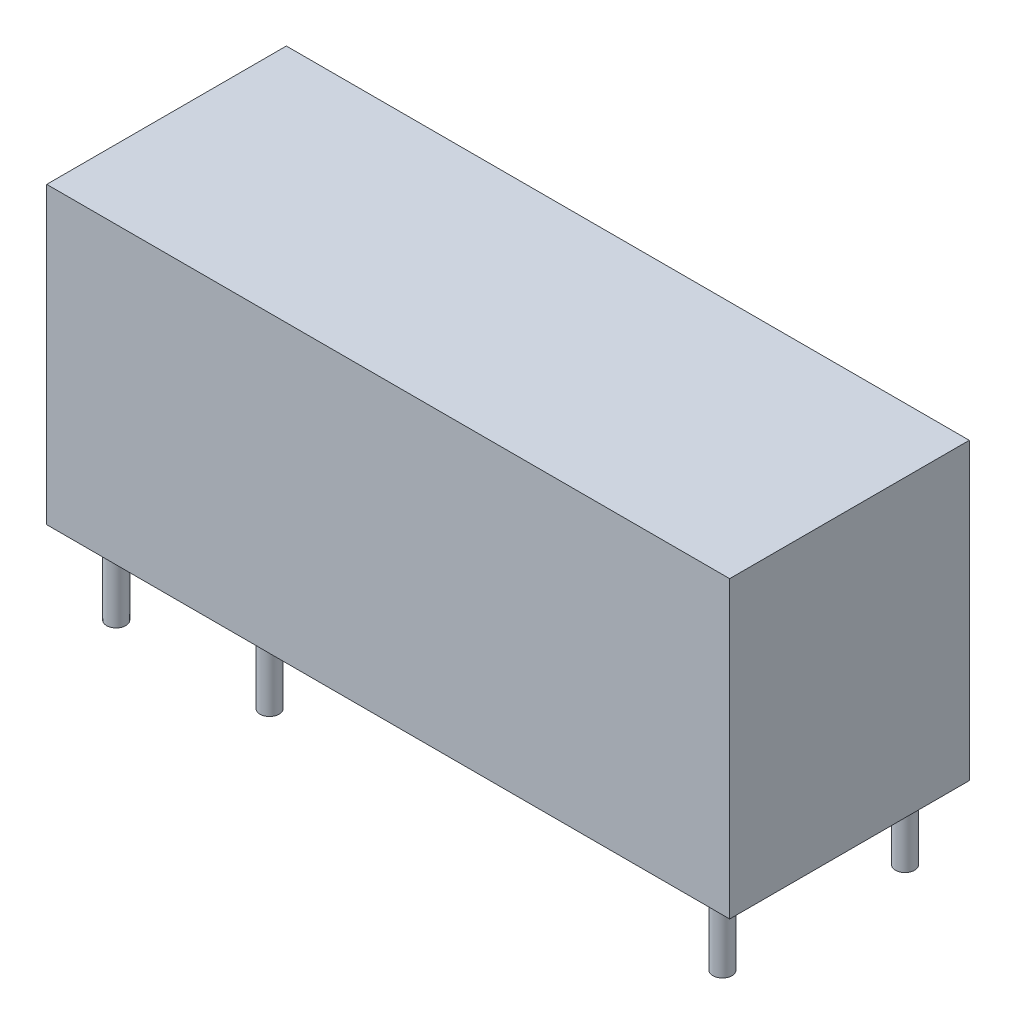
ISO-10303-21;
HEADER;
FILE_DESCRIPTION(('STEP AP214'),'2;1');
FILE_NAME('part.step','',(''),(''),'','','');
FILE_SCHEMA(('AUTOMOTIVE_DESIGN { 1 0 10303 214 1 1 1 1 }'));
ENDSEC;
DATA;
#1=APPLICATION_CONTEXT('core data for automotive mechanical design processes');
#2=APPLICATION_PROTOCOL_DEFINITION('international standard','automotive_design',2000,#1);
#3=PRODUCT_CONTEXT('',#1,'mechanical');
#4=PRODUCT('Part','Part','',(#3));
#5=PRODUCT_RELATED_PRODUCT_CATEGORY('part','',(#4));
#6=PRODUCT_DEFINITION_FORMATION('','',#4);
#7=PRODUCT_DEFINITION_CONTEXT('part definition',#1,'design');
#8=PRODUCT_DEFINITION('design','',#6,#7);
#9=PRODUCT_DEFINITION_SHAPE('','',#8);
#10=(LENGTH_UNIT() NAMED_UNIT(*) SI_UNIT(.MILLI.,.METRE.));
#11=(NAMED_UNIT(*) PLANE_ANGLE_UNIT() SI_UNIT($,.RADIAN.));
#12=(NAMED_UNIT(*) SI_UNIT($,.STERADIAN.) SOLID_ANGLE_UNIT());
#13=UNCERTAINTY_MEASURE_WITH_UNIT(LENGTH_MEASURE(1.E-05),#10,'distance_accuracy_value','');
#14=(GEOMETRIC_REPRESENTATION_CONTEXT(3) GLOBAL_UNCERTAINTY_ASSIGNED_CONTEXT((#13)) GLOBAL_UNIT_ASSIGNED_CONTEXT((#10,
#11,#12)) REPRESENTATION_CONTEXT('',''));
#15=CARTESIAN_POINT('',(0.,0.,0.));
#16=DIRECTION('',(0.,0.,1.));
#17=DIRECTION('',(1.,0.,0.));
#18=AXIS2_PLACEMENT_3D('',#15,#16,#17);
#19=CARTESIAN_POINT('',(-6.15,-3.2,3.8));
#20=DIRECTION('',(0.,-1.,0.));
#21=DIRECTION('',(0.,0.,-1.));
#22=AXIS2_PLACEMENT_3D('',#19,#20,#21);
#23=PLANE('',#22);
#24=CARTESIAN_POINT('',(-6.15,-3.2,3.8));
#25=DIRECTION('',(0.,1.,0.));
#26=DIRECTION('',(0.,0.,1.));
#27=AXIS2_PLACEMENT_3D('',#24,#25,#26);
#28=CIRCLE('',#27,0.4);
#29=CARTESIAN_POINT('',(-6.15,-3.2,4.2));
#30=VERTEX_POINT('',#29);
#31=EDGE_CURVE('E20',#30,#30,#28,.T.);
#32=ORIENTED_EDGE('',*,*,#31,.F.);
#33=EDGE_LOOP('',(#32));
#34=FACE_BOUND('',#33,.T.);
#35=ADVANCED_FACE('F17',(#34),#23,.T.);
#36=CARTESIAN_POINT('',(-12.55,-3.2,3.8));
#37=DIRECTION('',(0.,-1.,0.));
#38=DIRECTION('',(0.,0.,-1.));
#39=AXIS2_PLACEMENT_3D('',#36,#37,#38);
#40=PLANE('',#39);
#41=CARTESIAN_POINT('',(-12.55,-3.2,3.8));
#42=DIRECTION('',(0.,1.,0.));
#43=DIRECTION('',(0.,0.,1.));
#44=AXIS2_PLACEMENT_3D('',#41,#42,#43);
#45=CIRCLE('',#44,0.4);
#46=CARTESIAN_POINT('',(-12.55,-3.2,4.2));
#47=VERTEX_POINT('',#46);
#48=EDGE_CURVE('E106',#47,#47,#45,.T.);
#49=ORIENTED_EDGE('',*,*,#48,.F.);
#50=EDGE_LOOP('',(#49));
#51=FACE_BOUND('',#50,.T.);
#52=ADVANCED_FACE('F116',(#51),#40,.T.);
#53=CARTESIAN_POINT('',(-9.35,-3.2,-3.82));
#54=DIRECTION('',(0.,-1.,0.));
#55=DIRECTION('',(0.,0.,-1.));
#56=AXIS2_PLACEMENT_3D('',#53,#54,#55);
#57=PLANE('',#56);
#58=CARTESIAN_POINT('',(-9.35,-3.2,-3.82));
#59=DIRECTION('',(0.,1.,0.));
#60=DIRECTION('',(0.,0.,1.));
#61=AXIS2_PLACEMENT_3D('',#58,#59,#60);
#62=CIRCLE('',#61,0.4);
#63=CARTESIAN_POINT('',(-9.35,-3.2,-3.42));
#64=VERTEX_POINT('',#63);
#65=EDGE_CURVE('E104',#64,#64,#62,.T.);
#66=ORIENTED_EDGE('',*,*,#65,.F.);
#67=EDGE_LOOP('',(#66));
#68=FACE_BOUND('',#67,.T.);
#69=ADVANCED_FACE('F121',(#68),#57,.T.);
#70=CARTESIAN_POINT('',(12.75,-3.2,-3.82));
#71=DIRECTION('',(0.,-1.,0.));
#72=DIRECTION('',(0.,0.,-1.));
#73=AXIS2_PLACEMENT_3D('',#70,#71,#72);
#74=PLANE('',#73);
#75=CARTESIAN_POINT('',(12.75,-3.2,-3.82));
#76=DIRECTION('',(0.,1.,0.));
#77=DIRECTION('',(0.,0.,1.));
#78=AXIS2_PLACEMENT_3D('',#75,#76,#77);
#79=CIRCLE('',#78,0.4);
#80=CARTESIAN_POINT('',(12.75,-3.2,-3.42));
#81=VERTEX_POINT('',#80);
#82=EDGE_CURVE('E101',#81,#81,#79,.T.);
#83=ORIENTED_EDGE('',*,*,#82,.F.);
#84=EDGE_LOOP('',(#83));
#85=FACE_BOUND('',#84,.T.);
#86=ADVANCED_FACE('F166',(#85),#74,.T.);
#87=CARTESIAN_POINT('',(12.75,-3.2,3.8));
#88=DIRECTION('',(0.,-1.,0.));
#89=DIRECTION('',(0.,0.,-1.));
#90=AXIS2_PLACEMENT_3D('',#87,#88,#89);
#91=PLANE('',#90);
#92=CARTESIAN_POINT('',(12.75,-3.2,3.8));
#93=DIRECTION('',(0.,1.,0.));
#94=DIRECTION('',(0.,0.,1.));
#95=AXIS2_PLACEMENT_3D('',#92,#93,#94);
#96=CIRCLE('',#95,0.4);
#97=CARTESIAN_POINT('',(12.75,-3.2,4.2));
#98=VERTEX_POINT('',#97);
#99=EDGE_CURVE('E73',#98,#98,#96,.T.);
#100=ORIENTED_EDGE('',*,*,#99,.F.);
#101=EDGE_LOOP('',(#100));
#102=FACE_BOUND('',#101,.T.);
#103=ADVANCED_FACE('F162',(#102),#91,.T.);
#104=CARTESIAN_POINT('',(-6.15,-3.2,3.8));
#105=DIRECTION('',(0.,1.,0.));
#106=DIRECTION('',(0.,0.,1.));
#107=AXIS2_PLACEMENT_3D('',#104,#105,#106);
#108=CYLINDRICAL_SURFACE('',#107,0.4);
#109=CARTESIAN_POINT('',(-6.15,0.,3.8));
#110=DIRECTION('',(0.,1.,0.));
#111=DIRECTION('',(0.,0.,1.));
#112=AXIS2_PLACEMENT_3D('',#109,#110,#111);
#113=CIRCLE('',#112,0.4);
#114=CARTESIAN_POINT('',(-6.15,0.,4.2));
#115=VERTEX_POINT('',#114);
#116=EDGE_CURVE('E96',#115,#115,#113,.T.);
#117=ORIENTED_EDGE('',*,*,#116,.F.);
#118=EDGE_LOOP('',(#117));
#119=FACE_BOUND('',#118,.T.);
#120=ORIENTED_EDGE('',*,*,#31,.T.);
#121=EDGE_LOOP('',(#120));
#122=FACE_BOUND('',#121,.T.);
#123=ADVANCED_FACE('F113',(#119,#122),#108,.T.);
#124=CARTESIAN_POINT('',(-12.55,-3.2,3.8));
#125=DIRECTION('',(0.,1.,0.));
#126=DIRECTION('',(0.,0.,1.));
#127=AXIS2_PLACEMENT_3D('',#124,#125,#126);
#128=CYLINDRICAL_SURFACE('',#127,0.4);
#129=CARTESIAN_POINT('',(-12.55,0.,3.8));
#130=DIRECTION('',(0.,1.,0.));
#131=DIRECTION('',(0.,0.,1.));
#132=AXIS2_PLACEMENT_3D('',#129,#130,#131);
#133=CIRCLE('',#132,0.4);
#134=CARTESIAN_POINT('',(-12.55,0.,4.2));
#135=VERTEX_POINT('',#134);
#136=EDGE_CURVE('E93',#135,#135,#133,.T.);
#137=ORIENTED_EDGE('',*,*,#136,.F.);
#138=EDGE_LOOP('',(#137));
#139=FACE_BOUND('',#138,.T.);
#140=ORIENTED_EDGE('',*,*,#48,.T.);
#141=EDGE_LOOP('',(#140));
#142=FACE_BOUND('',#141,.T.);
#143=ADVANCED_FACE('F155',(#139,#142),#128,.T.);
#144=CARTESIAN_POINT('',(-9.35,-3.2,-3.82));
#145=DIRECTION('',(0.,1.,0.));
#146=DIRECTION('',(0.,0.,1.));
#147=AXIS2_PLACEMENT_3D('',#144,#145,#146);
#148=CYLINDRICAL_SURFACE('',#147,0.4);
#149=CARTESIAN_POINT('',(-9.35,0.,-3.82));
#150=DIRECTION('',(0.,1.,0.));
#151=DIRECTION('',(0.,0.,1.));
#152=AXIS2_PLACEMENT_3D('',#149,#150,#151);
#153=CIRCLE('',#152,0.4);
#154=CARTESIAN_POINT('',(-9.35,0.,-3.42));
#155=VERTEX_POINT('',#154);
#156=EDGE_CURVE('E90',#155,#155,#153,.T.);
#157=ORIENTED_EDGE('',*,*,#156,.F.);
#158=EDGE_LOOP('',(#157));
#159=FACE_BOUND('',#158,.T.);
#160=ORIENTED_EDGE('',*,*,#65,.T.);
#161=EDGE_LOOP('',(#160));
#162=FACE_BOUND('',#161,.T.);
#163=ADVANCED_FACE('F151',(#159,#162),#148,.T.);
#164=CARTESIAN_POINT('',(12.75,-3.2,-3.82));
#165=DIRECTION('',(0.,1.,0.));
#166=DIRECTION('',(0.,0.,1.));
#167=AXIS2_PLACEMENT_3D('',#164,#165,#166);
#168=CYLINDRICAL_SURFACE('',#167,0.4);
#169=CARTESIAN_POINT('',(12.75,0.,-3.82));
#170=DIRECTION('',(0.,1.,0.));
#171=DIRECTION('',(0.,0.,1.));
#172=AXIS2_PLACEMENT_3D('',#169,#170,#171);
#173=CIRCLE('',#172,0.4);
#174=CARTESIAN_POINT('',(12.75,0.,-3.42));
#175=VERTEX_POINT('',#174);
#176=EDGE_CURVE('E87',#175,#175,#173,.T.);
#177=ORIENTED_EDGE('',*,*,#176,.F.);
#178=EDGE_LOOP('',(#177));
#179=FACE_BOUND('',#178,.T.);
#180=ORIENTED_EDGE('',*,*,#82,.T.);
#181=EDGE_LOOP('',(#180));
#182=FACE_BOUND('',#181,.T.);
#183=ADVANCED_FACE('F147',(#179,#182),#168,.T.);
#184=CARTESIAN_POINT('',(12.75,-3.2,3.8));
#185=DIRECTION('',(0.,1.,0.));
#186=DIRECTION('',(0.,0.,1.));
#187=AXIS2_PLACEMENT_3D('',#184,#185,#186);
#188=CYLINDRICAL_SURFACE('',#187,0.4);
#189=CARTESIAN_POINT('',(12.75,0.,3.8));
#190=DIRECTION('',(0.,1.,0.));
#191=DIRECTION('',(0.,0.,1.));
#192=AXIS2_PLACEMENT_3D('',#189,#190,#191);
#193=CIRCLE('',#192,0.4);
#194=CARTESIAN_POINT('',(12.75,0.,4.2));
#195=VERTEX_POINT('',#194);
#196=EDGE_CURVE('E83',#195,#195,#193,.T.);
#197=ORIENTED_EDGE('',*,*,#196,.F.);
#198=EDGE_LOOP('',(#197));
#199=FACE_BOUND('',#198,.T.);
#200=ORIENTED_EDGE('',*,*,#99,.T.);
#201=EDGE_LOOP('',(#200));
#202=FACE_BOUND('',#201,.T.);
#203=ADVANCED_FACE('F144',(#199,#202),#188,.T.);
#204=CARTESIAN_POINT('',(-14.25,12.3,5.));
#205=DIRECTION('',(0.,0.,-1.));
#206=DIRECTION('',(-1.,0.,0.));
#207=AXIS2_PLACEMENT_3D('',#204,#205,#206);
#208=PLANE('',#207);
#209=DIRECTION('',(0.,1.,0.));
#210=VECTOR('',#209,1.);
#211=CARTESIAN_POINT('',(14.25,12.3,5.));
#212=LINE('',#211,#210);
#213=CARTESIAN_POINT('',(14.25,0.,5.));
#214=VERTEX_POINT('',#213);
#215=CARTESIAN_POINT('',(14.25,12.3,5.));
#216=VERTEX_POINT('',#215);
#217=EDGE_CURVE('E65',#214,#216,#212,.T.);
#218=ORIENTED_EDGE('',*,*,#217,.T.);
#219=DIRECTION('',(1.,0.,0.));
#220=VECTOR('',#219,1.);
#221=CARTESIAN_POINT('',(0.,12.3,5.));
#222=LINE('',#221,#220);
#223=CARTESIAN_POINT('',(-14.25,12.3,5.));
#224=VERTEX_POINT('',#223);
#225=EDGE_CURVE('E55',#216,#224,#222,.F.);
#226=ORIENTED_EDGE('',*,*,#225,.T.);
#227=DIRECTION('',(0.,1.,0.));
#228=VECTOR('',#227,1.);
#229=CARTESIAN_POINT('',(-14.25,12.3,5.));
#230=LINE('',#229,#228);
#231=CARTESIAN_POINT('',(-14.25,0.,5.));
#232=VERTEX_POINT('',#231);
#233=EDGE_CURVE('E79',#224,#232,#230,.F.);
#234=ORIENTED_EDGE('',*,*,#233,.T.);
#235=DIRECTION('',(1.,0.,0.));
#236=VECTOR('',#235,1.);
#237=CARTESIAN_POINT('',(0.,0.,5.));
#238=LINE('',#237,#236);
#239=EDGE_CURVE('E69',#214,#232,#238,.F.);
#240=ORIENTED_EDGE('',*,*,#239,.F.);
#241=EDGE_LOOP('',(#218,#226,#234,#240));
#242=FACE_BOUND('',#241,.T.);
#243=ADVANCED_FACE('F68',(#242),#208,.F.);
#244=CARTESIAN_POINT('',(14.25,12.3,5.));
#245=DIRECTION('',(-1.,0.,0.));
#246=DIRECTION('',(0.,0.,1.));
#247=AXIS2_PLACEMENT_3D('',#244,#245,#246);
#248=PLANE('',#247);
#249=DIRECTION('',(0.,1.,0.));
#250=VECTOR('',#249,1.);
#251=CARTESIAN_POINT('',(14.25,12.3,-5.));
#252=LINE('',#251,#250);
#253=CARTESIAN_POINT('',(14.25,0.,-5.));
#254=VERTEX_POINT('',#253);
#255=CARTESIAN_POINT('',(14.25,12.3,-5.));
#256=VERTEX_POINT('',#255);
#257=EDGE_CURVE('E77',#254,#256,#252,.T.);
#258=ORIENTED_EDGE('',*,*,#257,.T.);
#259=DIRECTION('',(0.,0.,-1.));
#260=VECTOR('',#259,1.);
#261=CARTESIAN_POINT('',(14.25,12.3,0.));
#262=LINE('',#261,#260);
#263=EDGE_CURVE('E62',#256,#216,#262,.F.);
#264=ORIENTED_EDGE('',*,*,#263,.T.);
#265=ORIENTED_EDGE('',*,*,#217,.F.);
#266=DIRECTION('',(0.,0.,-1.));
#267=VECTOR('',#266,1.);
#268=CARTESIAN_POINT('',(14.25,0.,0.));
#269=LINE('',#268,#267);
#270=EDGE_CURVE('E86',#254,#214,#269,.F.);
#271=ORIENTED_EDGE('',*,*,#270,.F.);
#272=EDGE_LOOP('',(#258,#264,#265,#271));
#273=FACE_BOUND('',#272,.T.);
#274=ADVANCED_FACE('F76',(#273),#248,.F.);
#275=CARTESIAN_POINT('',(0.,12.3,0.));
#276=DIRECTION('',(0.,-1.,0.));
#277=DIRECTION('',(0.,0.,-1.));
#278=AXIS2_PLACEMENT_3D('',#275,#276,#277);
#279=PLANE('',#278);
#280=DIRECTION('',(1.,0.,0.));
#281=VECTOR('',#280,1.);
#282=CARTESIAN_POINT('',(-14.25,12.3,-5.));
#283=LINE('',#282,#281);
#284=CARTESIAN_POINT('',(-14.25,12.3,-5.));
#285=VERTEX_POINT('',#284);
#286=EDGE_CURVE('E294',#256,#285,#283,.F.);
#287=ORIENTED_EDGE('',*,*,#286,.T.);
#288=DIRECTION('',(0.,0.,-1.));
#289=VECTOR('',#288,1.);
#290=CARTESIAN_POINT('',(-14.25,12.3,5.));
#291=LINE('',#290,#289);
#292=EDGE_CURVE('E64',#285,#224,#291,.F.);
#293=ORIENTED_EDGE('',*,*,#292,.T.);
#294=ORIENTED_EDGE('',*,*,#225,.F.);
#295=ORIENTED_EDGE('',*,*,#263,.F.);
#296=EDGE_LOOP('',(#287,#293,#294,#295));
#297=FACE_BOUND('',#296,.T.);
#298=ADVANCED_FACE('F60',(#297),#279,.F.);
#299=CARTESIAN_POINT('',(-14.25,12.3,5.));
#300=DIRECTION('',(1.,0.,0.));
#301=DIRECTION('',(0.,0.,-1.));
#302=AXIS2_PLACEMENT_3D('',#299,#300,#301);
#303=PLANE('',#302);
#304=ORIENTED_EDGE('',*,*,#233,.F.);
#305=ORIENTED_EDGE('',*,*,#292,.F.);
#306=DIRECTION('',(0.,1.,0.));
#307=VECTOR('',#306,1.);
#308=CARTESIAN_POINT('',(-14.25,12.3,-5.));
#309=LINE('',#308,#307);
#310=CARTESIAN_POINT('',(-14.25,0.,-5.));
#311=VERTEX_POINT('',#310);
#312=EDGE_CURVE('E26',#285,#311,#309,.F.);
#313=ORIENTED_EDGE('',*,*,#312,.T.);
#314=DIRECTION('',(0.,0.,-1.));
#315=VECTOR('',#314,1.);
#316=CARTESIAN_POINT('',(-14.25,0.,0.));
#317=LINE('',#316,#315);
#318=EDGE_CURVE('E34',#232,#311,#317,.T.);
#319=ORIENTED_EDGE('',*,*,#318,.F.);
#320=EDGE_LOOP('',(#304,#305,#313,#319));
#321=FACE_BOUND('',#320,.T.);
#322=ADVANCED_FACE('F131',(#321),#303,.F.);
#323=CARTESIAN_POINT('',(0.,0.,0.));
#324=DIRECTION('',(0.,-1.,0.));
#325=DIRECTION('',(0.,0.,-1.));
#326=AXIS2_PLACEMENT_3D('',#323,#324,#325);
#327=PLANE('',#326);
#328=ORIENTED_EDGE('',*,*,#318,.T.);
#329=DIRECTION('',(1.,0.,0.));
#330=VECTOR('',#329,1.);
#331=CARTESIAN_POINT('',(-14.25,0.,-5.));
#332=LINE('',#331,#330);
#333=EDGE_CURVE('E11',#311,#254,#332,.T.);
#334=ORIENTED_EDGE('',*,*,#333,.T.);
#335=ORIENTED_EDGE('',*,*,#270,.T.);
#336=ORIENTED_EDGE('',*,*,#239,.T.);
#337=EDGE_LOOP('',(#328,#334,#335,#336));
#338=FACE_BOUND('',#337,.T.);
#339=ORIENTED_EDGE('',*,*,#196,.T.);
#340=EDGE_LOOP('',(#339));
#341=FACE_BOUND('',#340,.T.);
#342=ORIENTED_EDGE('',*,*,#176,.T.);
#343=EDGE_LOOP('',(#342));
#344=FACE_BOUND('',#343,.T.);
#345=ORIENTED_EDGE('',*,*,#156,.T.);
#346=EDGE_LOOP('',(#345));
#347=FACE_BOUND('',#346,.T.);
#348=ORIENTED_EDGE('',*,*,#136,.T.);
#349=EDGE_LOOP('',(#348));
#350=FACE_BOUND('',#349,.T.);
#351=ORIENTED_EDGE('',*,*,#116,.T.);
#352=EDGE_LOOP('',(#351));
#353=FACE_BOUND('',#352,.T.);
#354=ADVANCED_FACE('F125',(#338,#341,#344,#347,#350,#353),#327,.T.);
#355=CARTESIAN_POINT('',(-14.25,12.3,-5.));
#356=DIRECTION('',(0.,0.,1.));
#357=DIRECTION('',(1.,0.,0.));
#358=AXIS2_PLACEMENT_3D('',#355,#356,#357);
#359=PLANE('',#358);
#360=ORIENTED_EDGE('',*,*,#312,.F.);
#361=ORIENTED_EDGE('',*,*,#286,.F.);
#362=ORIENTED_EDGE('',*,*,#257,.F.);
#363=ORIENTED_EDGE('',*,*,#333,.F.);
#364=EDGE_LOOP('',(#360,#361,#362,#363));
#365=FACE_BOUND('',#364,.T.);
#366=ADVANCED_FACE('F123',(#365),#359,.F.);
#367=CLOSED_SHELL('',(#35,#52,#69,#86,#103,#123,#143,#163,#183,#203,#243,#274,#298,#322,#354,#366));
#368=MANIFOLD_SOLID_BREP('B1',#367);
#369=ADVANCED_BREP_SHAPE_REPRESENTATION('',(#18,#368),#14);
#370=SHAPE_DEFINITION_REPRESENTATION(#9,#369);
ENDSEC;
END-ISO-10303-21;
